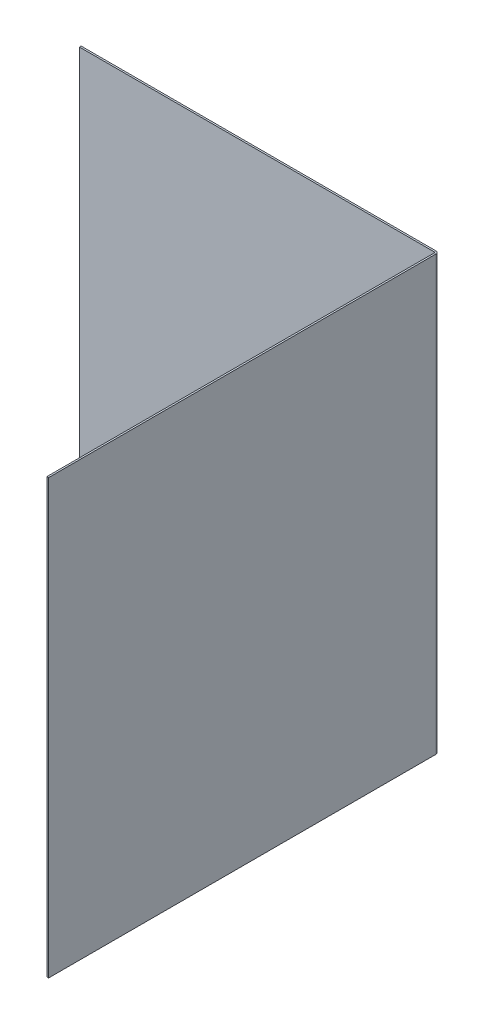
ISO-10303-21;
HEADER;
FILE_DESCRIPTION(('STEP AP214'),'2;1');
FILE_NAME('part.step','',(''),(''),'','','');
FILE_SCHEMA(('AUTOMOTIVE_DESIGN { 1 0 10303 214 1 1 1 1 }'));
ENDSEC;
DATA;
#1=APPLICATION_CONTEXT('core data for automotive mechanical design processes');
#2=APPLICATION_PROTOCOL_DEFINITION('international standard','automotive_design',2000,#1);
#3=PRODUCT_CONTEXT('',#1,'mechanical');
#4=PRODUCT('Part','Part','',(#3));
#5=PRODUCT_RELATED_PRODUCT_CATEGORY('part','',(#4));
#6=PRODUCT_DEFINITION_FORMATION('','',#4);
#7=PRODUCT_DEFINITION_CONTEXT('part definition',#1,'design');
#8=PRODUCT_DEFINITION('design','',#6,#7);
#9=PRODUCT_DEFINITION_SHAPE('','',#8);
#10=(LENGTH_UNIT() NAMED_UNIT(*) SI_UNIT(.MILLI.,.METRE.));
#11=(NAMED_UNIT(*) PLANE_ANGLE_UNIT() SI_UNIT($,.RADIAN.));
#12=(NAMED_UNIT(*) SI_UNIT($,.STERADIAN.) SOLID_ANGLE_UNIT());
#13=UNCERTAINTY_MEASURE_WITH_UNIT(LENGTH_MEASURE(1.E-05),#10,'distance_accuracy_value','');
#14=(GEOMETRIC_REPRESENTATION_CONTEXT(3) GLOBAL_UNCERTAINTY_ASSIGNED_CONTEXT((#13)) GLOBAL_UNIT_ASSIGNED_CONTEXT((#10,
#11,#12)) REPRESENTATION_CONTEXT('',''));
#15=CARTESIAN_POINT('',(0.,0.,0.));
#16=DIRECTION('',(0.,0.,1.));
#17=DIRECTION('',(1.,0.,0.));
#18=AXIS2_PLACEMENT_3D('',#15,#16,#17);
#19=CARTESIAN_POINT('',(330.,-200.,-1.5875));
#20=DIRECTION('',(0.,0.,1.));
#21=DIRECTION('',(1.,0.,0.));
#22=AXIS2_PLACEMENT_3D('',#19,#20,#21);
#23=PLANE('',#22);
#24=DIRECTION('',(0.,1.,0.));
#25=VECTOR('',#24,1.);
#26=CARTESIAN_POINT('',(327.6759,200.,-1.5875));
#27=LINE('',#26,#25);
#28=CARTESIAN_POINT('',(327.6759,200.,-1.5875));
#29=VERTEX_POINT('',#28);
#30=CARTESIAN_POINT('',(327.6759,-200.,-1.5875));
#31=VERTEX_POINT('',#30);
#32=EDGE_CURVE('E161',#29,#31,#27,.F.);
#33=ORIENTED_EDGE('',*,*,#32,.T.);
#34=DIRECTION('',(-1.,0.,0.));
#35=VECTOR('',#34,1.);
#36=CARTESIAN_POINT('',(330.,-200.,-1.5875));
#37=LINE('',#36,#35);
#38=CARTESIAN_POINT('',(0.,-200.,-1.5875));
#39=VERTEX_POINT('',#38);
#40=EDGE_CURVE('E193',#31,#39,#37,.T.);
#41=ORIENTED_EDGE('',*,*,#40,.T.);
#42=DIRECTION('',(0.,1.,0.));
#43=VECTOR('',#42,1.);
#44=CARTESIAN_POINT('',(0.,-200.,-1.5875));
#45=LINE('',#44,#43);
#46=CARTESIAN_POINT('',(0.,200.,-1.5875));
#47=VERTEX_POINT('',#46);
#48=EDGE_CURVE('E179',#39,#47,#45,.T.);
#49=ORIENTED_EDGE('',*,*,#48,.T.);
#50=DIRECTION('',(-1.,0.,0.));
#51=VECTOR('',#50,1.);
#52=CARTESIAN_POINT('',(330.,200.,-1.5875));
#53=LINE('',#52,#51);
#54=EDGE_CURVE('E13',#29,#47,#53,.T.);
#55=ORIENTED_EDGE('',*,*,#54,.F.);
#56=EDGE_LOOP('',(#33,#41,#49,#55));
#57=FACE_BOUND('',#56,.T.);
#58=ADVANCED_FACE('F57',(#57),#23,.F.);
#59=CARTESIAN_POINT('',(330.,200.,0.));
#60=DIRECTION('',(0.,1.,0.));
#61=DIRECTION('',(0.,0.,1.));
#62=AXIS2_PLACEMENT_3D('',#59,#60,#61);
#63=PLANE('',#62);
#64=DIRECTION('',(-1.,0.,0.));
#65=VECTOR('',#64,1.);
#66=CARTESIAN_POINT('',(330.,200.,0.));
#67=LINE('',#66,#65);
#68=CARTESIAN_POINT('',(327.6759,200.,0.));
#69=VERTEX_POINT('',#68);
#70=CARTESIAN_POINT('',(0.,200.,0.));
#71=VERTEX_POINT('',#70);
#72=EDGE_CURVE('E64',#69,#71,#67,.T.);
#73=ORIENTED_EDGE('',*,*,#72,.F.);
#74=DIRECTION('',(0.,0.,-1.));
#75=VECTOR('',#74,1.);
#76=CARTESIAN_POINT('',(327.6759,200.,0.));
#77=LINE('',#76,#75);
#78=EDGE_CURVE('E168',#69,#29,#77,.T.);
#79=ORIENTED_EDGE('',*,*,#78,.T.);
#80=ORIENTED_EDGE('',*,*,#54,.T.);
#81=DIRECTION('',(0.,0.,-1.));
#82=VECTOR('',#81,1.);
#83=CARTESIAN_POINT('',(0.,200.,0.));
#84=LINE('',#83,#82);
#85=EDGE_CURVE('E184',#71,#47,#84,.T.);
#86=ORIENTED_EDGE('',*,*,#85,.F.);
#87=EDGE_LOOP('',(#73,#79,#80,#86));
#88=FACE_BOUND('',#87,.T.);
#89=ADVANCED_FACE('F201',(#88),#63,.T.);
#90=CARTESIAN_POINT('',(330.,-200.,0.));
#91=DIRECTION('',(0.,0.,1.));
#92=DIRECTION('',(1.,0.,0.));
#93=AXIS2_PLACEMENT_3D('',#90,#91,#92);
#94=PLANE('',#93);
#95=DIRECTION('',(-1.,0.,0.));
#96=VECTOR('',#95,1.);
#97=CARTESIAN_POINT('',(330.,-200.,0.));
#98=LINE('',#97,#96);
#99=CARTESIAN_POINT('',(327.6759,-200.,0.));
#100=VERTEX_POINT('',#99);
#101=CARTESIAN_POINT('',(0.,-200.,0.));
#102=VERTEX_POINT('',#101);
#103=EDGE_CURVE('E195',#100,#102,#98,.T.);
#104=ORIENTED_EDGE('',*,*,#103,.F.);
#105=DIRECTION('',(0.,1.,0.));
#106=VECTOR('',#105,1.);
#107=CARTESIAN_POINT('',(327.6759,200.,0.));
#108=LINE('',#107,#106);
#109=EDGE_CURVE('E71',#69,#100,#108,.F.);
#110=ORIENTED_EDGE('',*,*,#109,.F.);
#111=ORIENTED_EDGE('',*,*,#72,.T.);
#112=DIRECTION('',(0.,1.,0.));
#113=VECTOR('',#112,1.);
#114=CARTESIAN_POINT('',(0.,-200.,0.));
#115=LINE('',#114,#113);
#116=EDGE_CURVE('E187',#102,#71,#115,.T.);
#117=ORIENTED_EDGE('',*,*,#116,.F.);
#118=EDGE_LOOP('',(#104,#110,#111,#117));
#119=FACE_BOUND('',#118,.T.);
#120=ADVANCED_FACE('F198',(#119),#94,.T.);
#121=CARTESIAN_POINT('',(330.,-200.,-1.5875));
#122=DIRECTION('',(0.,-1.,0.));
#123=DIRECTION('',(0.,0.,-1.));
#124=AXIS2_PLACEMENT_3D('',#121,#122,#123);
#125=PLANE('',#124);
#126=DIRECTION('',(0.,0.,-1.));
#127=VECTOR('',#126,1.);
#128=CARTESIAN_POINT('',(327.6759,-200.,0.));
#129=LINE('',#128,#127);
#130=EDGE_CURVE('E79',#100,#31,#129,.T.);
#131=ORIENTED_EDGE('',*,*,#130,.F.);
#132=ORIENTED_EDGE('',*,*,#103,.T.);
#133=DIRECTION('',(0.,0.,1.));
#134=VECTOR('',#133,1.);
#135=CARTESIAN_POINT('',(0.,-200.,-1.5875));
#136=LINE('',#135,#134);
#137=EDGE_CURVE('E190',#39,#102,#136,.T.);
#138=ORIENTED_EDGE('',*,*,#137,.F.);
#139=ORIENTED_EDGE('',*,*,#40,.F.);
#140=EDGE_LOOP('',(#131,#132,#138,#139));
#141=FACE_BOUND('',#140,.T.);
#142=ADVANCED_FACE('F206',(#141),#125,.T.);
#143=CARTESIAN_POINT('',(0.,0.,0.));
#144=DIRECTION('',(-1.,0.,0.));
#145=DIRECTION('',(0.,0.,1.));
#146=AXIS2_PLACEMENT_3D('',#143,#144,#145);
#147=PLANE('',#146);
#148=ORIENTED_EDGE('',*,*,#48,.F.);
#149=ORIENTED_EDGE('',*,*,#137,.T.);
#150=ORIENTED_EDGE('',*,*,#116,.T.);
#151=ORIENTED_EDGE('',*,*,#85,.T.);
#152=EDGE_LOOP('',(#148,#149,#150,#151));
#153=FACE_BOUND('',#152,.T.);
#154=ADVANCED_FACE('F204',(#153),#147,.T.);
#155=CARTESIAN_POINT('',(327.6759,-200.,0.736599999999979));
#156=DIRECTION('',(0.,-1.,0.));
#157=DIRECTION('',(0.,0.,-1.));
#158=AXIS2_PLACEMENT_3D('',#155,#156,#157);
#159=PLANE('',#158);
#160=DIRECTION('',(-1.,0.,0.));
#161=VECTOR('',#160,1.);
#162=CARTESIAN_POINT('',(330.,-200.,0.736599999999971));
#163=LINE('',#162,#161);
#164=CARTESIAN_POINT('',(328.4125,-200.,0.736599999999976));
#165=VERTEX_POINT('',#164);
#166=CARTESIAN_POINT('',(330.,-200.,0.736599999999971));
#167=VERTEX_POINT('',#166);
#168=EDGE_CURVE('E144',#165,#167,#163,.F.);
#169=ORIENTED_EDGE('',*,*,#168,.F.);
#170=CARTESIAN_POINT('',(327.6759,-200.,0.736599999999979));
#171=DIRECTION('',(0.,1.,0.));
#172=DIRECTION('',(0.,0.,1.));
#173=AXIS2_PLACEMENT_3D('',#170,#171,#172);
#174=CIRCLE('',#173,0.736599999999976);
#175=EDGE_CURVE('E171',#100,#165,#174,.F.);
#176=ORIENTED_EDGE('',*,*,#175,.F.);
#177=ORIENTED_EDGE('',*,*,#130,.T.);
#178=CARTESIAN_POINT('',(327.6759,-200.,0.736599999999979));
#179=DIRECTION('',(0.,1.,0.));
#180=DIRECTION('',(0.,0.,1.));
#181=AXIS2_PLACEMENT_3D('',#178,#179,#180);
#182=CIRCLE('',#181,2.32409999999998);
#183=EDGE_CURVE('E164',#31,#167,#182,.F.);
#184=ORIENTED_EDGE('',*,*,#183,.T.);
#185=EDGE_LOOP('',(#169,#176,#177,#184));
#186=FACE_BOUND('',#185,.T.);
#187=ADVANCED_FACE('F213',(#186),#159,.T.);
#188=CARTESIAN_POINT('',(327.6759,200.,0.736599999999979));
#189=DIRECTION('',(0.,-1.,0.));
#190=DIRECTION('',(0.,0.,-1.));
#191=AXIS2_PLACEMENT_3D('',#188,#189,#190);
#192=PLANE('',#191);
#193=CARTESIAN_POINT('',(327.6759,200.,0.736599999999979));
#194=DIRECTION('',(0.,1.,0.));
#195=DIRECTION('',(0.,0.,1.));
#196=AXIS2_PLACEMENT_3D('',#193,#194,#195);
#197=CIRCLE('',#196,0.736599999999976);
#198=CARTESIAN_POINT('',(328.4125,200.,0.736599999999976));
#199=VERTEX_POINT('',#198);
#200=EDGE_CURVE('E175',#199,#69,#197,.T.);
#201=ORIENTED_EDGE('',*,*,#200,.F.);
#202=DIRECTION('',(-1.,0.,0.));
#203=VECTOR('',#202,1.);
#204=CARTESIAN_POINT('',(328.4125,200.,0.736599999999976));
#205=LINE('',#204,#203);
#206=CARTESIAN_POINT('',(330.,200.,0.736599999999971));
#207=VERTEX_POINT('',#206);
#208=EDGE_CURVE('E155',#199,#207,#205,.F.);
#209=ORIENTED_EDGE('',*,*,#208,.T.);
#210=CARTESIAN_POINT('',(327.6759,200.,0.736599999999979));
#211=DIRECTION('',(0.,1.,0.));
#212=DIRECTION('',(0.,0.,1.));
#213=AXIS2_PLACEMENT_3D('',#210,#211,#212);
#214=CIRCLE('',#213,2.32409999999998);
#215=EDGE_CURVE('E165',#207,#29,#214,.T.);
#216=ORIENTED_EDGE('',*,*,#215,.T.);
#217=ORIENTED_EDGE('',*,*,#78,.F.);
#218=EDGE_LOOP('',(#201,#209,#216,#217));
#219=FACE_BOUND('',#218,.T.);
#220=ADVANCED_FACE('F226',(#219),#192,.F.);
#221=CARTESIAN_POINT('',(327.6759,200.,0.736599999999979));
#222=DIRECTION('',(0.,1.,0.));
#223=DIRECTION('',(1.,0.,0.));
#224=AXIS2_PLACEMENT_3D('',#221,#222,#223);
#225=CYLINDRICAL_SURFACE('',#224,2.32409999999998);
#226=ORIENTED_EDGE('',*,*,#32,.F.);
#227=ORIENTED_EDGE('',*,*,#215,.F.);
#228=DIRECTION('',(0.,1.,0.));
#229=VECTOR('',#228,1.);
#230=CARTESIAN_POINT('',(330.,-200.,0.736599999999971));
#231=LINE('',#230,#229);
#232=EDGE_CURVE('E153',#207,#167,#231,.F.);
#233=ORIENTED_EDGE('',*,*,#232,.T.);
#234=ORIENTED_EDGE('',*,*,#183,.F.);
#235=EDGE_LOOP('',(#226,#227,#233,#234));
#236=FACE_BOUND('',#235,.T.);
#237=ADVANCED_FACE('F217',(#236),#225,.T.);
#238=CARTESIAN_POINT('',(327.6759,200.,0.736599999999979));
#239=DIRECTION('',(0.,1.,0.));
#240=DIRECTION('',(1.,0.,0.));
#241=AXIS2_PLACEMENT_3D('',#238,#239,#240);
#242=CYLINDRICAL_SURFACE('',#241,0.736599999999976);
#243=ORIENTED_EDGE('',*,*,#109,.T.);
#244=ORIENTED_EDGE('',*,*,#175,.T.);
#245=DIRECTION('',(0.,1.,0.));
#246=VECTOR('',#245,1.);
#247=CARTESIAN_POINT('',(328.4125,-200.,0.736599999999976));
#248=LINE('',#247,#246);
#249=EDGE_CURVE('E158',#165,#199,#248,.T.);
#250=ORIENTED_EDGE('',*,*,#249,.T.);
#251=ORIENTED_EDGE('',*,*,#200,.T.);
#252=EDGE_LOOP('',(#243,#244,#250,#251));
#253=FACE_BOUND('',#252,.T.);
#254=ADVANCED_FACE('F209',(#253),#242,.F.);
#255=CARTESIAN_POINT('',(330.,-200.,0.));
#256=DIRECTION('',(0.,1.,0.));
#257=DIRECTION('',(0.,0.,1.));
#258=AXIS2_PLACEMENT_3D('',#255,#256,#257);
#259=PLANE('',#258);
#260=ORIENTED_EDGE('',*,*,#168,.T.);
#261=DIRECTION('',(0.,0.,-1.));
#262=VECTOR('',#261,1.);
#263=CARTESIAN_POINT('',(330.,-200.,-1.18108665393054E-12));
#264=LINE('',#263,#262);
#265=CARTESIAN_POINT('',(330.000000000001,-200.,358.4125));
#266=VERTEX_POINT('',#265);
#267=EDGE_CURVE('E125',#266,#167,#264,.T.);
#268=ORIENTED_EDGE('',*,*,#267,.F.);
#269=DIRECTION('',(-1.,0.,0.));
#270=VECTOR('',#269,1.);
#271=CARTESIAN_POINT('',(330.000000000001,-200.,358.4125));
#272=LINE('',#271,#270);
#273=CARTESIAN_POINT('',(328.412500000001,-200.,358.4125));
#274=VERTEX_POINT('',#273);
#275=EDGE_CURVE('E131',#266,#274,#272,.T.);
#276=ORIENTED_EDGE('',*,*,#275,.T.);
#277=DIRECTION('',(0.,0.,1.));
#278=VECTOR('',#277,1.);
#279=CARTESIAN_POINT('',(328.4125,-200.,0.));
#280=LINE('',#279,#278);
#281=EDGE_CURVE('E151',#274,#165,#280,.F.);
#282=ORIENTED_EDGE('',*,*,#281,.T.);
#283=EDGE_LOOP('',(#260,#268,#276,#282));
#284=FACE_BOUND('',#283,.T.);
#285=ADVANCED_FACE('F143',(#284),#259,.F.);
#286=CARTESIAN_POINT('',(330.000000000001,200.,358.4125));
#287=DIRECTION('',(0.,-1.,0.));
#288=DIRECTION('',(0.,0.,-1.));
#289=AXIS2_PLACEMENT_3D('',#286,#287,#288);
#290=PLANE('',#289);
#291=ORIENTED_EDGE('',*,*,#208,.F.);
#292=DIRECTION('',(0.,0.,-1.));
#293=VECTOR('',#292,1.);
#294=CARTESIAN_POINT('',(328.412500000001,200.,358.4125));
#295=LINE('',#294,#293);
#296=CARTESIAN_POINT('',(328.412500000001,200.,358.4125));
#297=VERTEX_POINT('',#296);
#298=EDGE_CURVE('E147',#199,#297,#295,.F.);
#299=ORIENTED_EDGE('',*,*,#298,.T.);
#300=DIRECTION('',(-1.,0.,0.));
#301=VECTOR('',#300,1.);
#302=CARTESIAN_POINT('',(330.000000000001,200.,358.4125));
#303=LINE('',#302,#301);
#304=CARTESIAN_POINT('',(330.000000000001,200.,358.4125));
#305=VERTEX_POINT('',#304);
#306=EDGE_CURVE('E140',#305,#297,#303,.T.);
#307=ORIENTED_EDGE('',*,*,#306,.F.);
#308=DIRECTION('',(0.,0.,1.));
#309=VECTOR('',#308,1.);
#310=CARTESIAN_POINT('',(330.,200.,-1.18108665393054E-12));
#311=LINE('',#310,#309);
#312=EDGE_CURVE('E127',#207,#305,#311,.T.);
#313=ORIENTED_EDGE('',*,*,#312,.F.);
#314=EDGE_LOOP('',(#291,#299,#307,#313));
#315=FACE_BOUND('',#314,.T.);
#316=ADVANCED_FACE('F220',(#315),#290,.F.);
#317=CARTESIAN_POINT('',(330.,0.,-1.18108665393054E-12));
#318=DIRECTION('',(-1.,0.,0.));
#319=DIRECTION('',(0.,0.,1.));
#320=AXIS2_PLACEMENT_3D('',#317,#318,#319);
#321=PLANE('',#320);
#322=ORIENTED_EDGE('',*,*,#232,.F.);
#323=ORIENTED_EDGE('',*,*,#312,.T.);
#324=DIRECTION('',(0.,-1.,0.));
#325=VECTOR('',#324,1.);
#326=CARTESIAN_POINT('',(330.000000000001,0.,358.4125));
#327=LINE('',#326,#325);
#328=EDGE_CURVE('E120',#305,#266,#327,.T.);
#329=ORIENTED_EDGE('',*,*,#328,.T.);
#330=ORIENTED_EDGE('',*,*,#267,.T.);
#331=EDGE_LOOP('',(#322,#323,#329,#330));
#332=FACE_BOUND('',#331,.T.);
#333=ADVANCED_FACE('F123',(#332),#321,.F.);
#334=CARTESIAN_POINT('',(328.4125,0.,-1.17554392730512E-12));
#335=DIRECTION('',(-1.,0.,0.));
#336=DIRECTION('',(0.,0.,1.));
#337=AXIS2_PLACEMENT_3D('',#334,#335,#336);
#338=PLANE('',#337);
#339=ORIENTED_EDGE('',*,*,#298,.F.);
#340=ORIENTED_EDGE('',*,*,#249,.F.);
#341=ORIENTED_EDGE('',*,*,#281,.F.);
#342=DIRECTION('',(0.,1.,0.));
#343=VECTOR('',#342,1.);
#344=CARTESIAN_POINT('',(328.412500000001,-200.,358.4125));
#345=LINE('',#344,#343);
#346=EDGE_CURVE('E136',#297,#274,#345,.F.);
#347=ORIENTED_EDGE('',*,*,#346,.F.);
#348=EDGE_LOOP('',(#339,#340,#341,#347));
#349=FACE_BOUND('',#348,.T.);
#350=ADVANCED_FACE('F224',(#349),#338,.T.);
#351=CARTESIAN_POINT('',(330.000000000001,-200.,358.4125));
#352=DIRECTION('',(0.,0.,-1.));
#353=DIRECTION('',(-1.,0.,0.));
#354=AXIS2_PLACEMENT_3D('',#351,#352,#353);
#355=PLANE('',#354);
#356=ORIENTED_EDGE('',*,*,#346,.T.);
#357=ORIENTED_EDGE('',*,*,#275,.F.);
#358=ORIENTED_EDGE('',*,*,#328,.F.);
#359=ORIENTED_EDGE('',*,*,#306,.T.);
#360=EDGE_LOOP('',(#356,#357,#358,#359));
#361=FACE_BOUND('',#360,.T.);
#362=ADVANCED_FACE('F134',(#361),#355,.F.);
#363=CLOSED_SHELL('',(#58,#89,#120,#142,#154,#187,#220,#237,#254,#285,#316,#333,#350,#362));
#364=MANIFOLD_SOLID_BREP('B2',#363);
#365=ADVANCED_BREP_SHAPE_REPRESENTATION('',(#18,#364),#14);
#366=SHAPE_DEFINITION_REPRESENTATION(#9,#365);
ENDSEC;
END-ISO-10303-21;
